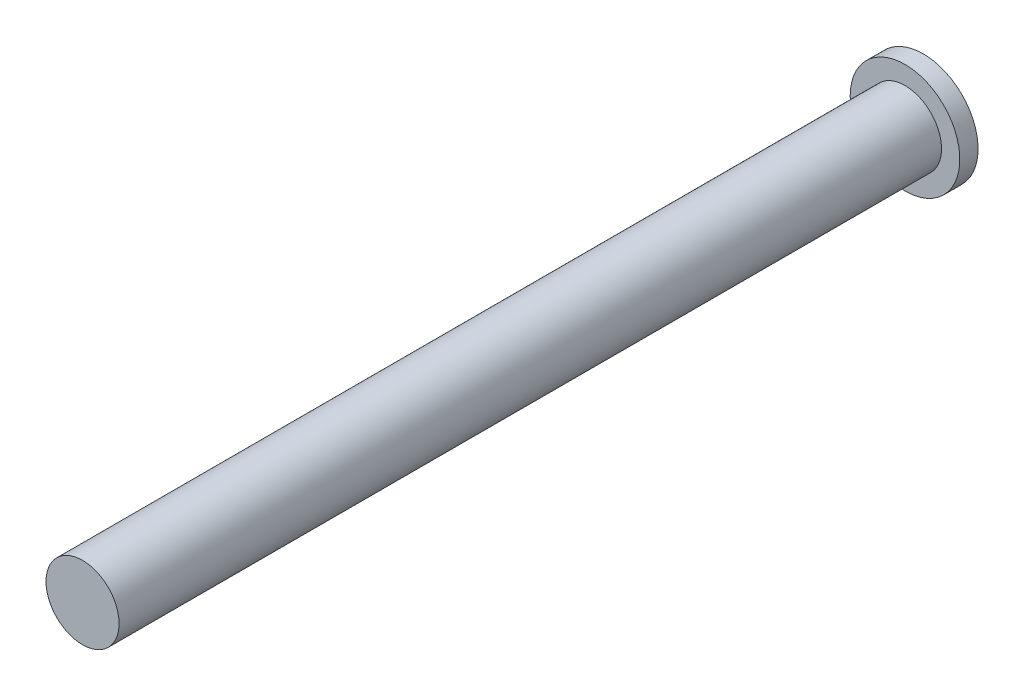
ISO-10303-21;
HEADER;
FILE_DESCRIPTION(('STEP AP214'),'2;1');
FILE_NAME('part.step','',(''),(''),'','','');
FILE_SCHEMA(('AUTOMOTIVE_DESIGN { 1 0 10303 214 1 1 1 1 }'));
ENDSEC;
DATA;
#1=APPLICATION_CONTEXT('core data for automotive mechanical design processes');
#2=APPLICATION_PROTOCOL_DEFINITION('international standard','automotive_design',2000,#1);
#3=PRODUCT_CONTEXT('',#1,'mechanical');
#4=PRODUCT('Part','Part','',(#3));
#5=PRODUCT_RELATED_PRODUCT_CATEGORY('part','',(#4));
#6=PRODUCT_DEFINITION_FORMATION('','',#4);
#7=PRODUCT_DEFINITION_CONTEXT('part definition',#1,'design');
#8=PRODUCT_DEFINITION('design','',#6,#7);
#9=PRODUCT_DEFINITION_SHAPE('','',#8);
#10=(LENGTH_UNIT() NAMED_UNIT(*) SI_UNIT(.MILLI.,.METRE.));
#11=(NAMED_UNIT(*) PLANE_ANGLE_UNIT() SI_UNIT($,.RADIAN.));
#12=(NAMED_UNIT(*) SI_UNIT($,.STERADIAN.) SOLID_ANGLE_UNIT());
#13=UNCERTAINTY_MEASURE_WITH_UNIT(LENGTH_MEASURE(1.E-05),#10,'distance_accuracy_value','');
#14=(GEOMETRIC_REPRESENTATION_CONTEXT(3) GLOBAL_UNCERTAINTY_ASSIGNED_CONTEXT((#13)) GLOBAL_UNIT_ASSIGNED_CONTEXT((#10,
#11,#12)) REPRESENTATION_CONTEXT('',''));
#15=CARTESIAN_POINT('',(0.,0.,0.));
#16=DIRECTION('',(0.,0.,1.));
#17=DIRECTION('',(1.,0.,0.));
#18=AXIS2_PLACEMENT_3D('',#15,#16,#17);
#19=CARTESIAN_POINT('',(0.,0.,45.));
#20=DIRECTION('',(0.,0.,-1.));
#21=DIRECTION('',(-1.,0.,0.));
#22=AXIS2_PLACEMENT_3D('',#19,#20,#21);
#23=CYLINDRICAL_SURFACE('',#22,2.);
#24=CARTESIAN_POINT('',(0.,0.,45.));
#25=DIRECTION('',(0.,0.,1.));
#26=DIRECTION('',(1.,0.,0.));
#27=AXIS2_PLACEMENT_3D('',#24,#25,#26);
#28=CIRCLE('',#27,2.);
#29=CARTESIAN_POINT('',(-2.,0.,45.));
#30=VERTEX_POINT('',#29);
#31=EDGE_CURVE('E10',#30,#30,#28,.T.);
#32=CARTESIAN_POINT('',(0.,0.,0.));
#33=DIRECTION('',(0.,0.,-1.));
#34=DIRECTION('',(-1.,0.,0.));
#35=AXIS2_PLACEMENT_3D('',#32,#33,#34);
#36=CIRCLE('',#35,2.);
#37=CARTESIAN_POINT('',(-2.,0.,0.));
#38=VERTEX_POINT('',#37);
#39=EDGE_CURVE('E39',#38,#38,#36,.T.);
#40=CARTESIAN_POINT('',(-2.,0.,45.));
#41=CARTESIAN_POINT('',(-2.,0.,44.53125));
#42=CARTESIAN_POINT('',(-2.,0.,44.0625));
#43=CARTESIAN_POINT('',(-2.,0.,43.125));
#44=CARTESIAN_POINT('',(-2.,0.,42.65625));
#45=CARTESIAN_POINT('',(-2.,0.,41.71875));
#46=CARTESIAN_POINT('',(-2.,0.,41.25));
#47=CARTESIAN_POINT('',(-2.,0.,40.3125));
#48=CARTESIAN_POINT('',(-2.,0.,39.84375));
#49=CARTESIAN_POINT('',(-2.,0.,38.90625));
#50=CARTESIAN_POINT('',(-2.,0.,38.4375));
#51=CARTESIAN_POINT('',(-2.,0.,37.5));
#52=CARTESIAN_POINT('',(-2.,0.,37.03125));
#53=CARTESIAN_POINT('',(-2.,0.,36.09375));
#54=CARTESIAN_POINT('',(-2.,0.,35.625));
#55=CARTESIAN_POINT('',(-2.,0.,34.6875));
#56=CARTESIAN_POINT('',(-2.,0.,34.21875));
#57=CARTESIAN_POINT('',(-2.,0.,33.28125));
#58=CARTESIAN_POINT('',(-2.,0.,32.8125));
#59=CARTESIAN_POINT('',(-2.,0.,31.875));
#60=CARTESIAN_POINT('',(-2.,0.,31.40625));
#61=CARTESIAN_POINT('',(-2.,0.,30.46875));
#62=CARTESIAN_POINT('',(-2.,0.,30.));
#63=CARTESIAN_POINT('',(-2.,0.,29.0625));
#64=CARTESIAN_POINT('',(-2.,0.,28.59375));
#65=CARTESIAN_POINT('',(-2.,0.,27.65625));
#66=CARTESIAN_POINT('',(-2.,0.,27.1875));
#67=CARTESIAN_POINT('',(-2.,0.,26.25));
#68=CARTESIAN_POINT('',(-2.,0.,25.78125));
#69=CARTESIAN_POINT('',(-2.,0.,24.84375));
#70=CARTESIAN_POINT('',(-2.,0.,24.375));
#71=CARTESIAN_POINT('',(-2.,0.,23.4375));
#72=CARTESIAN_POINT('',(-2.,0.,22.96875));
#73=CARTESIAN_POINT('',(-2.,0.,22.03125));
#74=CARTESIAN_POINT('',(-2.,0.,21.5625));
#75=CARTESIAN_POINT('',(-2.,0.,20.625));
#76=CARTESIAN_POINT('',(-2.,0.,20.15625));
#77=CARTESIAN_POINT('',(-2.,0.,19.21875));
#78=CARTESIAN_POINT('',(-2.,0.,18.75));
#79=CARTESIAN_POINT('',(-2.,0.,17.8125));
#80=CARTESIAN_POINT('',(-2.,0.,17.34375));
#81=CARTESIAN_POINT('',(-2.,0.,16.40625));
#82=CARTESIAN_POINT('',(-2.,0.,15.9375));
#83=CARTESIAN_POINT('',(-2.,0.,15.));
#84=CARTESIAN_POINT('',(-2.,0.,14.53125));
#85=CARTESIAN_POINT('',(-2.,0.,13.59375));
#86=CARTESIAN_POINT('',(-2.,0.,13.125));
#87=CARTESIAN_POINT('',(-2.,0.,12.1875));
#88=CARTESIAN_POINT('',(-2.,0.,11.71875));
#89=CARTESIAN_POINT('',(-2.,0.,10.78125));
#90=CARTESIAN_POINT('',(-2.,0.,10.3125));
#91=CARTESIAN_POINT('',(-2.,0.,9.37500000000001));
#92=CARTESIAN_POINT('',(-2.,0.,8.90625000000001));
#93=CARTESIAN_POINT('',(-2.,0.,7.96875000000001));
#94=CARTESIAN_POINT('',(-2.,0.,7.5));
#95=CARTESIAN_POINT('',(-2.,0.,6.5625));
#96=CARTESIAN_POINT('',(-2.,0.,6.09375));
#97=CARTESIAN_POINT('',(-2.,0.,5.15625000000001));
#98=CARTESIAN_POINT('',(-2.,0.,4.68750000000001));
#99=CARTESIAN_POINT('',(-2.,0.,3.75000000000001));
#100=CARTESIAN_POINT('',(-2.,0.,3.28125000000001));
#101=CARTESIAN_POINT('',(-2.,0.,2.34375000000001));
#102=CARTESIAN_POINT('',(-2.,0.,1.87500000000001));
#103=CARTESIAN_POINT('',(-2.,0.,0.937500000000006));
#104=CARTESIAN_POINT('',(-2.,0.,0.468750000000007));
#105=CARTESIAN_POINT('',(-2.,0.,0.));
#106=B_SPLINE_CURVE_WITH_KNOTS('',3,(#40,#41,#42,#43,#44,#45,#46,#47,#48,#49,#50,#51,#52,#53,
#54,#55,#56,#57,#58,#59,#60,#61,#62,#63,#64,#65,#66,#67,#68,#69,#70,#71,#72,#73,#74,#75,#76,#77,
#78,#79,#80,#81,#82,#83,#84,#85,#86,#87,#88,#89,#90,#91,#92,#93,#94,#95,#96,#97,#98,#99,#100,
#101,#102,#103,#104,#105),.UNSPECIFIED.,.F.,.F.,(4,2,2,2,2,2,2,2,2,2,2,2,2,2,2,2,2,2,2,2,2,2,2,
2,2,2,2,2,2,2,2,2,4),(0.,1.40625,2.8125,4.21874999999999,5.625,7.03125,8.43749999999999,
9.84374999999999,11.25,12.65625,14.0625,15.46875,16.875,18.28125,19.6875,21.09375,22.5,23.90625,
25.3125,26.71875,28.125,29.53125,30.9375,32.34375,33.75,35.15625,36.5625,37.96875,39.375,
40.78125,42.1875,43.59375,45.),.UNSPECIFIED.);
#107=EDGE_CURVE('BSEAM33',#30,#38,#106,.T.);
#108=ORIENTED_EDGE('',*,*,#31,.F.);
#109=ORIENTED_EDGE('',*,*,#39,.F.);
#110=ORIENTED_EDGE('',*,*,#107,.T.);
#111=ORIENTED_EDGE('',*,*,#107,.F.);
#112=EDGE_LOOP('',(#108,#110,#109,#111));
#113=FACE_BOUND('',#112,.T.);
#114=ADVANCED_FACE('F33',(#113),#23,.T.);
#115=CARTESIAN_POINT('',(0.,0.,45.));
#116=DIRECTION('',(0.,0.,1.));
#117=DIRECTION('',(1.,0.,0.));
#118=AXIS2_PLACEMENT_3D('',#115,#116,#117);
#119=PLANE('',#118);
#120=ORIENTED_EDGE('',*,*,#31,.T.);
#121=EDGE_LOOP('',(#120));
#122=FACE_BOUND('',#121,.T.);
#123=ADVANCED_FACE('F66',(#122),#119,.T.);
#124=CARTESIAN_POINT('',(0.,0.,-1.));
#125=DIRECTION('',(0.,0.,1.));
#126=DIRECTION('',(1.,0.,0.));
#127=AXIS2_PLACEMENT_3D('',#124,#125,#126);
#128=CYLINDRICAL_SURFACE('',#127,3.);
#129=CARTESIAN_POINT('',(0.,0.,-1.));
#130=DIRECTION('',(0.,0.,-1.));
#131=DIRECTION('',(-1.,0.,0.));
#132=AXIS2_PLACEMENT_3D('',#129,#130,#131);
#133=CIRCLE('',#132,3.);
#134=CARTESIAN_POINT('',(-3.,0.,-1.));
#135=VERTEX_POINT('',#134);
#136=EDGE_CURVE('E43',#135,#135,#133,.T.);
#137=ORIENTED_EDGE('',*,*,#136,.F.);
#138=EDGE_LOOP('',(#137));
#139=FACE_BOUND('',#138,.T.);
#140=CARTESIAN_POINT('',(0.,0.,0.));
#141=DIRECTION('',(0.,0.,-1.));
#142=DIRECTION('',(-1.,0.,0.));
#143=AXIS2_PLACEMENT_3D('',#140,#141,#142);
#144=CIRCLE('',#143,3.);
#145=CARTESIAN_POINT('',(-3.,0.,0.));
#146=VERTEX_POINT('',#145);
#147=EDGE_CURVE('E47',#146,#146,#144,.T.);
#148=ORIENTED_EDGE('',*,*,#147,.T.);
#149=EDGE_LOOP('',(#148));
#150=FACE_BOUND('',#149,.T.);
#151=ADVANCED_FACE('F53',(#139,#150),#128,.T.);
#152=CARTESIAN_POINT('',(0.,0.,-1.));
#153=DIRECTION('',(0.,0.,-1.));
#154=DIRECTION('',(-1.,0.,0.));
#155=AXIS2_PLACEMENT_3D('',#152,#153,#154);
#156=PLANE('',#155);
#157=ORIENTED_EDGE('',*,*,#136,.T.);
#158=EDGE_LOOP('',(#157));
#159=FACE_BOUND('',#158,.T.);
#160=ADVANCED_FACE('F57',(#159),#156,.T.);
#161=CARTESIAN_POINT('',(0.,0.,0.));
#162=DIRECTION('',(0.,0.,-1.));
#163=DIRECTION('',(-1.,0.,0.));
#164=AXIS2_PLACEMENT_3D('',#161,#162,#163);
#165=PLANE('',#164);
#166=ORIENTED_EDGE('',*,*,#39,.T.);
#167=EDGE_LOOP('',(#166));
#168=FACE_BOUND('',#167,.T.);
#169=ORIENTED_EDGE('',*,*,#147,.F.);
#170=EDGE_LOOP('',(#169));
#171=FACE_BOUND('',#170,.T.);
#172=ADVANCED_FACE('F55',(#168,#171),#165,.F.);
#173=CLOSED_SHELL('',(#114,#123,#151,#160,#172));
#174=MANIFOLD_SOLID_BREP('B2',#173);
#175=ADVANCED_BREP_SHAPE_REPRESENTATION('',(#18,#174),#14);
#176=SHAPE_DEFINITION_REPRESENTATION(#9,#175);
ENDSEC;
END-ISO-10303-21;
